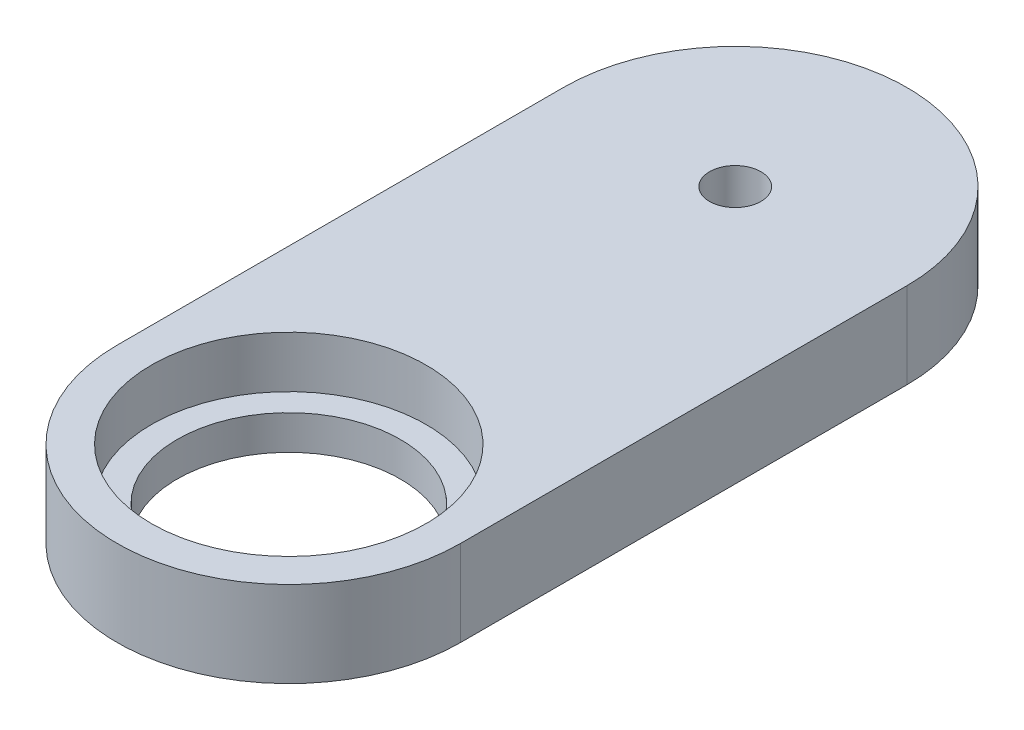
ISO-10303-21;
HEADER;
FILE_DESCRIPTION(('STEP AP214'),'2;1');
FILE_NAME('part.step','',(''),(''),'','','');
FILE_SCHEMA(('AUTOMOTIVE_DESIGN { 1 0 10303 214 1 1 1 1 }'));
ENDSEC;
DATA;
#1=APPLICATION_CONTEXT('core data for automotive mechanical design processes');
#2=APPLICATION_PROTOCOL_DEFINITION('international standard','automotive_design',2000,#1);
#3=PRODUCT_CONTEXT('',#1,'mechanical');
#4=PRODUCT('Part','Part','',(#3));
#5=PRODUCT_RELATED_PRODUCT_CATEGORY('part','',(#4));
#6=PRODUCT_DEFINITION_FORMATION('','',#4);
#7=PRODUCT_DEFINITION_CONTEXT('part definition',#1,'design');
#8=PRODUCT_DEFINITION('design','',#6,#7);
#9=PRODUCT_DEFINITION_SHAPE('','',#8);
#10=(LENGTH_UNIT() NAMED_UNIT(*) SI_UNIT(.MILLI.,.METRE.));
#11=(NAMED_UNIT(*) PLANE_ANGLE_UNIT() SI_UNIT($,.RADIAN.));
#12=(NAMED_UNIT(*) SI_UNIT($,.STERADIAN.) SOLID_ANGLE_UNIT());
#13=UNCERTAINTY_MEASURE_WITH_UNIT(LENGTH_MEASURE(1.E-05),#10,'distance_accuracy_value','');
#14=(GEOMETRIC_REPRESENTATION_CONTEXT(3) GLOBAL_UNCERTAINTY_ASSIGNED_CONTEXT((#13)) GLOBAL_UNIT_ASSIGNED_CONTEXT((#10,
#11,#12)) REPRESENTATION_CONTEXT('',''));
#15=CARTESIAN_POINT('',(0.,0.,0.));
#16=DIRECTION('',(0.,0.,1.));
#17=DIRECTION('',(1.,0.,0.));
#18=AXIS2_PLACEMENT_3D('',#15,#16,#17);
#19=CARTESIAN_POINT('',(10.,5.,26.));
#20=DIRECTION('',(0.,-1.,0.));
#21=DIRECTION('',(0.,0.,-1.));
#22=AXIS2_PLACEMENT_3D('',#19,#20,#21);
#23=CYLINDRICAL_SURFACE('',#22,6.5);
#24=CARTESIAN_POINT('',(10.,0.,26.));
#25=DIRECTION('',(0.,1.,0.));
#26=DIRECTION('',(0.,0.,1.));
#27=AXIS2_PLACEMENT_3D('',#24,#25,#26);
#28=CIRCLE('',#27,6.5);
#29=CARTESIAN_POINT('',(10.,0.,32.5));
#30=VERTEX_POINT('',#29);
#31=EDGE_CURVE('E119',#30,#30,#28,.T.);
#32=ORIENTED_EDGE('',*,*,#31,.F.);
#33=EDGE_LOOP('',(#32));
#34=FACE_BOUND('',#33,.T.);
#35=CARTESIAN_POINT('',(10.,2.,26.));
#36=DIRECTION('',(0.,1.,0.));
#37=DIRECTION('',(0.,0.,1.));
#38=AXIS2_PLACEMENT_3D('',#35,#36,#37);
#39=CIRCLE('',#38,6.5);
#40=CARTESIAN_POINT('',(10.,2.,32.5));
#41=VERTEX_POINT('',#40);
#42=EDGE_CURVE('E39',#41,#41,#39,.T.);
#43=ORIENTED_EDGE('',*,*,#42,.T.);
#44=EDGE_LOOP('',(#43));
#45=FACE_BOUND('',#44,.T.);
#46=ADVANCED_FACE('F35',(#34,#45),#23,.F.);
#47=CARTESIAN_POINT('',(10.,5.,0.));
#48=DIRECTION('',(0.,1.,0.));
#49=DIRECTION('',(0.,0.,1.));
#50=AXIS2_PLACEMENT_3D('',#47,#48,#49);
#51=PLANE('',#50);
#52=CARTESIAN_POINT('',(10.,5.,26.));
#53=DIRECTION('',(0.,1.,0.));
#54=DIRECTION('',(0.,0.,1.));
#55=AXIS2_PLACEMENT_3D('',#52,#53,#54);
#56=CIRCLE('',#55,8.);
#57=CARTESIAN_POINT('',(10.,5.,34.));
#58=VERTEX_POINT('',#57);
#59=EDGE_CURVE('E124',#58,#58,#56,.T.);
#60=ORIENTED_EDGE('',*,*,#59,.F.);
#61=EDGE_LOOP('',(#60));
#62=FACE_BOUND('',#61,.T.);
#63=CARTESIAN_POINT('',(10.,5.,0.));
#64=DIRECTION('',(0.,1.,0.));
#65=DIRECTION('',(0.,0.,1.));
#66=AXIS2_PLACEMENT_3D('',#63,#64,#65);
#67=CIRCLE('',#66,1.5);
#68=CARTESIAN_POINT('',(10.,5.,1.5));
#69=VERTEX_POINT('',#68);
#70=EDGE_CURVE('E104',#69,#69,#67,.T.);
#71=ORIENTED_EDGE('',*,*,#70,.F.);
#72=EDGE_LOOP('',(#71));
#73=FACE_BOUND('',#72,.T.);
#74=CARTESIAN_POINT('',(10.,5.,0.));
#75=DIRECTION('',(0.,1.,0.));
#76=DIRECTION('',(0.,0.,1.));
#77=AXIS2_PLACEMENT_3D('',#74,#75,#76);
#78=CIRCLE('',#77,10.);
#79=CARTESIAN_POINT('',(20.,5.,0.));
#80=VERTEX_POINT('',#79);
#81=CARTESIAN_POINT('',(0.,5.,0.));
#82=VERTEX_POINT('',#81);
#83=EDGE_CURVE('E88',#80,#82,#78,.T.);
#84=ORIENTED_EDGE('',*,*,#83,.T.);
#85=DIRECTION('',(0.,0.,1.));
#86=VECTOR('',#85,1.);
#87=CARTESIAN_POINT('',(0.,5.,0.));
#88=LINE('',#87,#86);
#89=CARTESIAN_POINT('',(0.,5.,26.));
#90=VERTEX_POINT('',#89);
#91=EDGE_CURVE('E83',#82,#90,#88,.T.);
#92=ORIENTED_EDGE('',*,*,#91,.T.);
#93=CARTESIAN_POINT('',(10.,5.,26.));
#94=DIRECTION('',(0.,1.,0.));
#95=DIRECTION('',(0.,0.,-1.));
#96=AXIS2_PLACEMENT_3D('',#93,#94,#95);
#97=CIRCLE('',#96,10.);
#98=CARTESIAN_POINT('',(20.,5.,26.));
#99=VERTEX_POINT('',#98);
#100=EDGE_CURVE('E86',#90,#99,#97,.T.);
#101=ORIENTED_EDGE('',*,*,#100,.T.);
#102=DIRECTION('',(0.,0.,-1.));
#103=VECTOR('',#102,1.);
#104=CARTESIAN_POINT('',(20.,5.,26.));
#105=LINE('',#104,#103);
#106=EDGE_CURVE('E53',#99,#80,#105,.T.);
#107=ORIENTED_EDGE('',*,*,#106,.T.);
#108=EDGE_LOOP('',(#84,#92,#101,#107));
#109=FACE_BOUND('',#108,.T.);
#110=ADVANCED_FACE('F84',(#62,#73,#109),#51,.T.);
#111=CARTESIAN_POINT('',(10.,0.,0.));
#112=DIRECTION('',(0.,1.,0.));
#113=DIRECTION('',(0.,0.,1.));
#114=AXIS2_PLACEMENT_3D('',#111,#112,#113);
#115=PLANE('',#114);
#116=CARTESIAN_POINT('',(10.,0.,0.));
#117=DIRECTION('',(0.,1.,0.));
#118=DIRECTION('',(0.,0.,1.));
#119=AXIS2_PLACEMENT_3D('',#116,#117,#118);
#120=CIRCLE('',#119,10.);
#121=CARTESIAN_POINT('',(20.,0.,0.));
#122=VERTEX_POINT('',#121);
#123=CARTESIAN_POINT('',(0.,0.,0.));
#124=VERTEX_POINT('',#123);
#125=EDGE_CURVE('E101',#122,#124,#120,.T.);
#126=ORIENTED_EDGE('',*,*,#125,.F.);
#127=DIRECTION('',(0.,0.,-1.));
#128=VECTOR('',#127,1.);
#129=CARTESIAN_POINT('',(20.,0.,26.));
#130=LINE('',#129,#128);
#131=CARTESIAN_POINT('',(20.,0.,26.));
#132=VERTEX_POINT('',#131);
#133=EDGE_CURVE('E76',#132,#122,#130,.T.);
#134=ORIENTED_EDGE('',*,*,#133,.F.);
#135=CARTESIAN_POINT('',(10.,0.,26.));
#136=DIRECTION('',(0.,1.,0.));
#137=DIRECTION('',(0.,0.,-1.));
#138=AXIS2_PLACEMENT_3D('',#135,#136,#137);
#139=CIRCLE('',#138,10.);
#140=CARTESIAN_POINT('',(0.,0.,26.));
#141=VERTEX_POINT('',#140);
#142=EDGE_CURVE('E70',#141,#132,#139,.T.);
#143=ORIENTED_EDGE('',*,*,#142,.F.);
#144=DIRECTION('',(0.,0.,1.));
#145=VECTOR('',#144,1.);
#146=CARTESIAN_POINT('',(0.,0.,0.));
#147=LINE('',#146,#145);
#148=EDGE_CURVE('E92',#124,#141,#147,.T.);
#149=ORIENTED_EDGE('',*,*,#148,.F.);
#150=EDGE_LOOP('',(#126,#134,#143,#149));
#151=FACE_BOUND('',#150,.T.);
#152=CARTESIAN_POINT('',(10.,0.,0.));
#153=DIRECTION('',(0.,1.,0.));
#154=DIRECTION('',(0.,0.,1.));
#155=AXIS2_PLACEMENT_3D('',#152,#153,#154);
#156=CIRCLE('',#155,1.5);
#157=CARTESIAN_POINT('',(10.,0.,1.5));
#158=VERTEX_POINT('',#157);
#159=EDGE_CURVE('E116',#158,#158,#156,.T.);
#160=ORIENTED_EDGE('',*,*,#159,.T.);
#161=EDGE_LOOP('',(#160));
#162=FACE_BOUND('',#161,.T.);
#163=ORIENTED_EDGE('',*,*,#31,.T.);
#164=EDGE_LOOP('',(#163));
#165=FACE_BOUND('',#164,.T.);
#166=ADVANCED_FACE('F112',(#151,#162,#165),#115,.F.);
#167=CARTESIAN_POINT('',(10.,5.,0.));
#168=DIRECTION('',(0.,-1.,0.));
#169=DIRECTION('',(0.,0.,-1.));
#170=AXIS2_PLACEMENT_3D('',#167,#168,#169);
#171=CYLINDRICAL_SURFACE('',#170,10.);
#172=ORIENTED_EDGE('',*,*,#125,.T.);
#173=DIRECTION('',(0.,-1.,0.));
#174=VECTOR('',#173,1.);
#175=CARTESIAN_POINT('',(0.,5.,0.));
#176=LINE('',#175,#174);
#177=EDGE_CURVE('E11',#82,#124,#176,.T.);
#178=ORIENTED_EDGE('',*,*,#177,.F.);
#179=ORIENTED_EDGE('',*,*,#83,.F.);
#180=DIRECTION('',(0.,-1.,0.));
#181=VECTOR('',#180,1.);
#182=CARTESIAN_POINT('',(20.,5.,0.));
#183=LINE('',#182,#181);
#184=EDGE_CURVE('E97',#80,#122,#183,.T.);
#185=ORIENTED_EDGE('',*,*,#184,.T.);
#186=EDGE_LOOP('',(#172,#178,#179,#185));
#187=FACE_BOUND('',#186,.T.);
#188=ADVANCED_FACE('F37',(#187),#171,.T.);
#189=CARTESIAN_POINT('',(0.,5.,0.));
#190=DIRECTION('',(1.,0.,0.));
#191=DIRECTION('',(0.,0.,-1.));
#192=AXIS2_PLACEMENT_3D('',#189,#190,#191);
#193=PLANE('',#192);
#194=ORIENTED_EDGE('',*,*,#148,.T.);
#195=DIRECTION('',(0.,-1.,0.));
#196=VECTOR('',#195,1.);
#197=CARTESIAN_POINT('',(0.,5.,26.));
#198=LINE('',#197,#196);
#199=EDGE_CURVE('E45',#90,#141,#198,.T.);
#200=ORIENTED_EDGE('',*,*,#199,.F.);
#201=ORIENTED_EDGE('',*,*,#91,.F.);
#202=ORIENTED_EDGE('',*,*,#177,.T.);
#203=EDGE_LOOP('',(#194,#200,#201,#202));
#204=FACE_BOUND('',#203,.T.);
#205=ADVANCED_FACE('F91',(#204),#193,.F.);
#206=CARTESIAN_POINT('',(10.,5.,26.));
#207=DIRECTION('',(0.,-1.,0.));
#208=DIRECTION('',(0.,0.,-1.));
#209=AXIS2_PLACEMENT_3D('',#206,#207,#208);
#210=CYLINDRICAL_SURFACE('',#209,10.);
#211=ORIENTED_EDGE('',*,*,#142,.T.);
#212=DIRECTION('',(0.,-1.,0.));
#213=VECTOR('',#212,1.);
#214=CARTESIAN_POINT('',(20.,5.,26.));
#215=LINE('',#214,#213);
#216=EDGE_CURVE('E93',#99,#132,#215,.T.);
#217=ORIENTED_EDGE('',*,*,#216,.F.);
#218=ORIENTED_EDGE('',*,*,#100,.F.);
#219=ORIENTED_EDGE('',*,*,#199,.T.);
#220=EDGE_LOOP('',(#211,#217,#218,#219));
#221=FACE_BOUND('',#220,.T.);
#222=ADVANCED_FACE('F95',(#221),#210,.T.);
#223=CARTESIAN_POINT('',(20.,5.,26.));
#224=DIRECTION('',(-1.,0.,0.));
#225=DIRECTION('',(0.,0.,1.));
#226=AXIS2_PLACEMENT_3D('',#223,#224,#225);
#227=PLANE('',#226);
#228=ORIENTED_EDGE('',*,*,#133,.T.);
#229=ORIENTED_EDGE('',*,*,#184,.F.);
#230=ORIENTED_EDGE('',*,*,#106,.F.);
#231=ORIENTED_EDGE('',*,*,#216,.T.);
#232=EDGE_LOOP('',(#228,#229,#230,#231));
#233=FACE_BOUND('',#232,.T.);
#234=ADVANCED_FACE('F109',(#233),#227,.F.);
#235=CARTESIAN_POINT('',(10.,5.,0.));
#236=DIRECTION('',(0.,-1.,0.));
#237=DIRECTION('',(0.,0.,-1.));
#238=AXIS2_PLACEMENT_3D('',#235,#236,#237);
#239=CYLINDRICAL_SURFACE('',#238,1.5);
#240=ORIENTED_EDGE('',*,*,#70,.T.);
#241=EDGE_LOOP('',(#240));
#242=FACE_BOUND('',#241,.T.);
#243=ORIENTED_EDGE('',*,*,#159,.F.);
#244=EDGE_LOOP('',(#243));
#245=FACE_BOUND('',#244,.T.);
#246=ADVANCED_FACE('F142',(#242,#245),#239,.F.);
#247=CARTESIAN_POINT('',(10.,2.,26.));
#248=DIRECTION('',(0.,1.,0.));
#249=DIRECTION('',(0.,0.,1.));
#250=AXIS2_PLACEMENT_3D('',#247,#248,#249);
#251=CYLINDRICAL_SURFACE('',#250,8.);
#252=CARTESIAN_POINT('',(10.,2.,26.));
#253=DIRECTION('',(0.,1.,0.));
#254=DIRECTION('',(0.,0.,1.));
#255=AXIS2_PLACEMENT_3D('',#252,#253,#254);
#256=CIRCLE('',#255,8.);
#257=CARTESIAN_POINT('',(10.,2.,34.));
#258=VERTEX_POINT('',#257);
#259=EDGE_CURVE('E127',#258,#258,#256,.T.);
#260=ORIENTED_EDGE('',*,*,#259,.F.);
#261=EDGE_LOOP('',(#260));
#262=FACE_BOUND('',#261,.T.);
#263=ORIENTED_EDGE('',*,*,#59,.T.);
#264=EDGE_LOOP('',(#263));
#265=FACE_BOUND('',#264,.T.);
#266=ADVANCED_FACE('F137',(#262,#265),#251,.F.);
#267=CARTESIAN_POINT('',(10.,2.,26.));
#268=DIRECTION('',(0.,1.,0.));
#269=DIRECTION('',(0.,0.,1.));
#270=AXIS2_PLACEMENT_3D('',#267,#268,#269);
#271=PLANE('',#270);
#272=ORIENTED_EDGE('',*,*,#42,.F.);
#273=EDGE_LOOP('',(#272));
#274=FACE_BOUND('',#273,.T.);
#275=ORIENTED_EDGE('',*,*,#259,.T.);
#276=EDGE_LOOP('',(#275));
#277=FACE_BOUND('',#276,.T.);
#278=ADVANCED_FACE('F135',(#274,#277),#271,.T.);
#279=CLOSED_SHELL('',(#46,#110,#166,#188,#205,#222,#234,#246,#266,#278));
#280=MANIFOLD_SOLID_BREP('B2',#279);
#281=ADVANCED_BREP_SHAPE_REPRESENTATION('',(#18,#280),#14);
#282=SHAPE_DEFINITION_REPRESENTATION(#9,#281);
ENDSEC;
END-ISO-10303-21;
